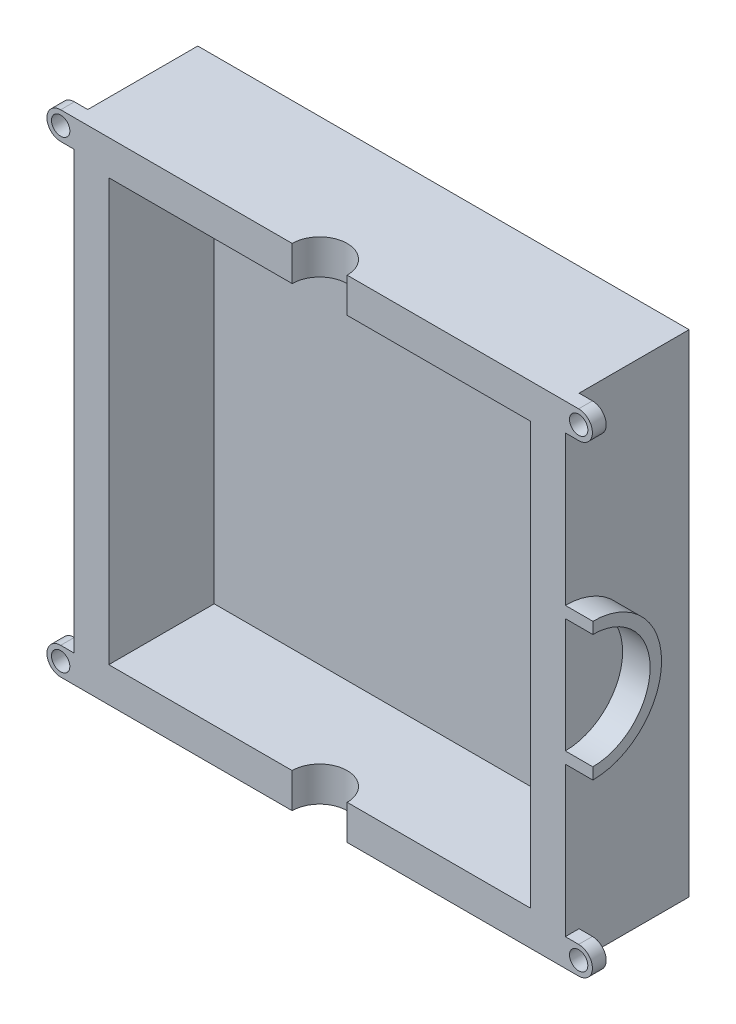
ISO-10303-21;
HEADER;
FILE_DESCRIPTION(('STEP AP214'),'2;1');
FILE_NAME('part.step','',(''),(''),'','','');
FILE_SCHEMA(('AUTOMOTIVE_DESIGN { 1 0 10303 214 1 1 1 1 }'));
ENDSEC;
DATA;
#1=APPLICATION_CONTEXT('core data for automotive mechanical design processes');
#2=APPLICATION_PROTOCOL_DEFINITION('international standard','automotive_design',2000,#1);
#3=PRODUCT_CONTEXT('',#1,'mechanical');
#4=PRODUCT('Part','Part','',(#3));
#5=PRODUCT_RELATED_PRODUCT_CATEGORY('part','',(#4));
#6=PRODUCT_DEFINITION_FORMATION('','',#4);
#7=PRODUCT_DEFINITION_CONTEXT('part definition',#1,'design');
#8=PRODUCT_DEFINITION('design','',#6,#7);
#9=PRODUCT_DEFINITION_SHAPE('','',#8);
#10=(LENGTH_UNIT() NAMED_UNIT(*) SI_UNIT(.MILLI.,.METRE.));
#11=(NAMED_UNIT(*) PLANE_ANGLE_UNIT() SI_UNIT($,.RADIAN.));
#12=(NAMED_UNIT(*) SI_UNIT($,.STERADIAN.) SOLID_ANGLE_UNIT());
#13=UNCERTAINTY_MEASURE_WITH_UNIT(LENGTH_MEASURE(1.E-05),#10,'distance_accuracy_value','');
#14=(GEOMETRIC_REPRESENTATION_CONTEXT(3) GLOBAL_UNCERTAINTY_ASSIGNED_CONTEXT((#13)) GLOBAL_UNIT_ASSIGNED_CONTEXT((#10,
#11,#12)) REPRESENTATION_CONTEXT('',''));
#15=CARTESIAN_POINT('',(0.,0.,0.));
#16=DIRECTION('',(0.,0.,1.));
#17=DIRECTION('',(1.,0.,0.));
#18=AXIS2_PLACEMENT_3D('',#15,#16,#17);
#19=CARTESIAN_POINT('',(53.59,-53.59,27.));
#20=DIRECTION('',(-1.,0.,0.));
#21=DIRECTION('',(0.,0.,1.));
#22=AXIS2_PLACEMENT_3D('',#19,#20,#21);
#23=PLANE('',#22);
#24=DIRECTION('',(0.,1.,0.));
#25=VECTOR('',#24,1.);
#26=CARTESIAN_POINT('',(53.59,-53.59,27.));
#27=LINE('',#26,#25);
#28=CARTESIAN_POINT('',(53.59,-12.5,27.));
#29=VERTEX_POINT('',#28);
#30=CARTESIAN_POINT('',(53.59,12.5,27.));
#31=VERTEX_POINT('',#30);
#32=EDGE_CURVE('E417',#29,#31,#27,.T.);
#33=ORIENTED_EDGE('',*,*,#32,.F.);
#34=CARTESIAN_POINT('',(53.59,0.,27.));
#35=DIRECTION('',(1.,0.,0.));
#36=DIRECTION('',(0.,0.,-1.));
#37=AXIS2_PLACEMENT_3D('',#34,#35,#36);
#38=CIRCLE('',#37,12.5);
#39=EDGE_CURVE('E338',#29,#31,#38,.T.);
#40=ORIENTED_EDGE('',*,*,#39,.T.);
#41=EDGE_LOOP('',(#33,#40));
#42=FACE_BOUND('',#41,.T.);
#43=ADVANCED_FACE('F41',(#42),#23,.F.);
#44=CARTESIAN_POINT('',(-53.59,53.59,27.));
#45=DIRECTION('',(0.,-1.,0.));
#46=DIRECTION('',(0.,0.,-1.));
#47=AXIS2_PLACEMENT_3D('',#44,#45,#46);
#48=PLANE('',#47);
#49=DIRECTION('',(-1.,0.,0.));
#50=VECTOR('',#49,1.);
#51=CARTESIAN_POINT('',(-53.59,53.59,27.));
#52=LINE('',#51,#50);
#53=CARTESIAN_POINT('',(56.5,53.59,27.));
#54=VERTEX_POINT('',#53);
#55=CARTESIAN_POINT('',(6.,53.59,27.));
#56=VERTEX_POINT('',#55);
#57=EDGE_CURVE('E423',#54,#56,#52,.T.);
#58=ORIENTED_EDGE('',*,*,#57,.F.);
#59=DIRECTION('',(0.,0.,1.));
#60=VECTOR('',#59,1.);
#61=CARTESIAN_POINT('',(56.5,53.59,24.));
#62=LINE('',#61,#60);
#63=CARTESIAN_POINT('',(56.5,53.59,24.));
#64=VERTEX_POINT('',#63);
#65=EDGE_CURVE('E242',#64,#54,#62,.T.);
#66=ORIENTED_EDGE('',*,*,#65,.F.);
#67=DIRECTION('',(-1.,0.,0.));
#68=VECTOR('',#67,1.);
#69=CARTESIAN_POINT('',(51.1723022861703,53.59,24.));
#70=LINE('',#69,#68);
#71=CARTESIAN_POINT('',(53.59,53.59,24.));
#72=VERTEX_POINT('',#71);
#73=EDGE_CURVE('E257',#64,#72,#70,.T.);
#74=ORIENTED_EDGE('',*,*,#73,.T.);
#75=DIRECTION('',(0.,0.,-1.));
#76=VECTOR('',#75,1.);
#77=CARTESIAN_POINT('',(53.59,53.59,27.));
#78=LINE('',#77,#76);
#79=CARTESIAN_POINT('',(53.59,53.59,0.));
#80=VERTEX_POINT('',#79);
#81=EDGE_CURVE('E447',#72,#80,#78,.T.);
#82=ORIENTED_EDGE('',*,*,#81,.T.);
#83=DIRECTION('',(-1.,0.,0.));
#84=VECTOR('',#83,1.);
#85=CARTESIAN_POINT('',(-53.59,53.59,0.));
#86=LINE('',#85,#84);
#87=CARTESIAN_POINT('',(-53.59,53.59,0.));
#88=VERTEX_POINT('',#87);
#89=EDGE_CURVE('E435',#80,#88,#86,.T.);
#90=ORIENTED_EDGE('',*,*,#89,.T.);
#91=DIRECTION('',(0.,0.,-1.));
#92=VECTOR('',#91,1.);
#93=CARTESIAN_POINT('',(-53.59,53.59,27.));
#94=LINE('',#93,#92);
#95=CARTESIAN_POINT('',(-53.59,53.59,24.));
#96=VERTEX_POINT('',#95);
#97=EDGE_CURVE('E443',#96,#88,#94,.T.);
#98=ORIENTED_EDGE('',*,*,#97,.F.);
#99=DIRECTION('',(-1.,0.,0.));
#100=VECTOR('',#99,1.);
#101=CARTESIAN_POINT('',(-56.5,53.59,24.));
#102=LINE('',#101,#100);
#103=CARTESIAN_POINT('',(-56.5,53.59,24.));
#104=VERTEX_POINT('',#103);
#105=EDGE_CURVE('E321',#96,#104,#102,.T.);
#106=ORIENTED_EDGE('',*,*,#105,.T.);
#107=DIRECTION('',(0.,0.,1.));
#108=VECTOR('',#107,1.);
#109=CARTESIAN_POINT('',(-56.5,53.59,24.));
#110=LINE('',#109,#108);
#111=CARTESIAN_POINT('',(-56.5,53.59,27.));
#112=VERTEX_POINT('',#111);
#113=EDGE_CURVE('E333',#104,#112,#110,.T.);
#114=ORIENTED_EDGE('',*,*,#113,.T.);
#115=CARTESIAN_POINT('',(-6.,53.59,27.));
#116=VERTEX_POINT('',#115);
#117=EDGE_CURVE('E419',#116,#112,#52,.T.);
#118=ORIENTED_EDGE('',*,*,#117,.F.);
#119=CARTESIAN_POINT('',(0.,53.59,27.));
#120=DIRECTION('',(0.,1.,0.));
#121=DIRECTION('',(0.,0.,1.));
#122=AXIS2_PLACEMENT_3D('',#119,#120,#121);
#123=CIRCLE('',#122,6.);
#124=EDGE_CURVE('E364',#56,#116,#123,.T.);
#125=ORIENTED_EDGE('',*,*,#124,.F.);
#126=EDGE_LOOP('',(#58,#66,#74,#82,#90,#98,#106,#114,#118,#125));
#127=FACE_BOUND('',#126,.T.);
#128=ADVANCED_FACE('F462',(#127),#48,.F.);
#129=CARTESIAN_POINT('',(0.,0.,27.));
#130=DIRECTION('',(0.,0.,-1.));
#131=DIRECTION('',(-1.,0.,0.));
#132=AXIS2_PLACEMENT_3D('',#129,#130,#131);
#133=PLANE('',#132);
#134=ORIENTED_EDGE('',*,*,#117,.T.);
#135=CARTESIAN_POINT('',(-56.5,50.59,27.));
#136=DIRECTION('',(0.,0.,1.));
#137=DIRECTION('',(1.,0.,0.));
#138=AXIS2_PLACEMENT_3D('',#135,#136,#137);
#139=CIRCLE('',#138,3.00000000000001);
#140=CARTESIAN_POINT('',(-56.5,47.59,27.));
#141=VERTEX_POINT('',#140);
#142=EDGE_CURVE('E313',#112,#141,#139,.T.);
#143=ORIENTED_EDGE('',*,*,#142,.T.);
#144=DIRECTION('',(1.,0.,0.));
#145=VECTOR('',#144,1.);
#146=CARTESIAN_POINT('',(-56.5,47.59,27.));
#147=LINE('',#146,#145);
#148=CARTESIAN_POINT('',(-53.59,47.59,27.));
#149=VERTEX_POINT('',#148);
#150=EDGE_CURVE('E322',#141,#149,#147,.T.);
#151=ORIENTED_EDGE('',*,*,#150,.T.);
#152=DIRECTION('',(0.,-1.,0.));
#153=VECTOR('',#152,1.);
#154=CARTESIAN_POINT('',(-53.59,-53.59,27.));
#155=LINE('',#154,#153);
#156=CARTESIAN_POINT('',(-53.59,-47.59,27.));
#157=VERTEX_POINT('',#156);
#158=EDGE_CURVE('E421',#149,#157,#155,.T.);
#159=ORIENTED_EDGE('',*,*,#158,.T.);
#160=DIRECTION('',(-1.,0.,0.));
#161=VECTOR('',#160,1.);
#162=CARTESIAN_POINT('',(-56.5,-47.59,27.));
#163=LINE('',#162,#161);
#164=CARTESIAN_POINT('',(-56.5,-47.59,27.));
#165=VERTEX_POINT('',#164);
#166=EDGE_CURVE('E295',#157,#165,#163,.T.);
#167=ORIENTED_EDGE('',*,*,#166,.T.);
#168=CARTESIAN_POINT('',(-56.5,-50.59,27.));
#169=DIRECTION('',(0.,0.,1.));
#170=DIRECTION('',(-1.,0.,0.));
#171=AXIS2_PLACEMENT_3D('',#168,#169,#170);
#172=CIRCLE('',#171,3.00000000000001);
#173=CARTESIAN_POINT('',(-56.5,-53.59,27.));
#174=VERTEX_POINT('',#173);
#175=EDGE_CURVE('E298',#165,#174,#172,.T.);
#176=ORIENTED_EDGE('',*,*,#175,.T.);
#177=DIRECTION('',(1.,0.,0.));
#178=VECTOR('',#177,1.);
#179=CARTESIAN_POINT('',(-53.59,-53.59,27.));
#180=LINE('',#179,#178);
#181=CARTESIAN_POINT('',(-6.,-53.59,27.));
#182=VERTEX_POINT('',#181);
#183=EDGE_CURVE('E430',#174,#182,#180,.T.);
#184=ORIENTED_EDGE('',*,*,#183,.T.);
#185=DIRECTION('',(0.,1.,0.));
#186=VECTOR('',#185,1.);
#187=CARTESIAN_POINT('',(-6.,-53.59,27.));
#188=LINE('',#187,#186);
#189=CARTESIAN_POINT('',(-6.,-46.,27.));
#190=VERTEX_POINT('',#189);
#191=EDGE_CURVE('E380',#182,#190,#188,.T.);
#192=ORIENTED_EDGE('',*,*,#191,.T.);
#193=DIRECTION('',(1.,0.,0.));
#194=VECTOR('',#193,1.);
#195=CARTESIAN_POINT('',(-46.,-46.,27.));
#196=LINE('',#195,#194);
#197=CARTESIAN_POINT('',(-46.,-46.,27.));
#198=VERTEX_POINT('',#197);
#199=EDGE_CURVE('E381',#198,#190,#196,.T.);
#200=ORIENTED_EDGE('',*,*,#199,.F.);
#201=DIRECTION('',(0.,-1.,0.));
#202=VECTOR('',#201,1.);
#203=CARTESIAN_POINT('',(-46.,46.,27.));
#204=LINE('',#203,#202);
#205=CARTESIAN_POINT('',(-46.,46.,27.));
#206=VERTEX_POINT('',#205);
#207=EDGE_CURVE('E397',#206,#198,#204,.T.);
#208=ORIENTED_EDGE('',*,*,#207,.F.);
#209=DIRECTION('',(-1.,0.,0.));
#210=VECTOR('',#209,1.);
#211=CARTESIAN_POINT('',(-46.,46.,27.));
#212=LINE('',#211,#210);
#213=CARTESIAN_POINT('',(-6.,46.,27.));
#214=VERTEX_POINT('',#213);
#215=EDGE_CURVE('E398',#214,#206,#212,.T.);
#216=ORIENTED_EDGE('',*,*,#215,.F.);
#217=EDGE_CURVE('E375',#214,#116,#188,.T.);
#218=ORIENTED_EDGE('',*,*,#217,.T.);
#219=EDGE_LOOP('',(#134,#143,#151,#159,#167,#176,#184,#192,#200,#208,#216,#218));
#220=FACE_BOUND('',#219,.T.);
#221=CARTESIAN_POINT('',(-56.5,50.59,27.));
#222=DIRECTION('',(0.,0.,1.));
#223=DIRECTION('',(1.,0.,0.));
#224=AXIS2_PLACEMENT_3D('',#221,#222,#223);
#225=CIRCLE('',#224,2.);
#226=CARTESIAN_POINT('',(-54.5,50.59,27.));
#227=VERTEX_POINT('',#226);
#228=EDGE_CURVE('E264',#227,#227,#225,.T.);
#229=ORIENTED_EDGE('',*,*,#228,.F.);
#230=EDGE_LOOP('',(#229));
#231=FACE_BOUND('',#230,.T.);
#232=CARTESIAN_POINT('',(-56.5,-50.59,27.));
#233=DIRECTION('',(0.,0.,1.));
#234=DIRECTION('',(-1.,0.,0.));
#235=AXIS2_PLACEMENT_3D('',#232,#233,#234);
#236=CIRCLE('',#235,2.);
#237=CARTESIAN_POINT('',(-58.5,-50.59,27.));
#238=VERTEX_POINT('',#237);
#239=EDGE_CURVE('E266',#238,#238,#236,.T.);
#240=ORIENTED_EDGE('',*,*,#239,.F.);
#241=EDGE_LOOP('',(#240));
#242=FACE_BOUND('',#241,.T.);
#243=ADVANCED_FACE('F478',(#220,#231,#242),#133,.F.);
#244=CARTESIAN_POINT('',(53.59,-47.59,27.));
#245=VERTEX_POINT('',#244);
#246=CARTESIAN_POINT('',(53.59,-15.,27.));
#247=VERTEX_POINT('',#246);
#248=EDGE_CURVE('E420',#245,#247,#27,.T.);
#249=ORIENTED_EDGE('',*,*,#248,.F.);
#250=DIRECTION('',(0.,0.,-1.));
#251=VECTOR('',#250,1.);
#252=CARTESIAN_POINT('',(53.59,-47.59,27.));
#253=LINE('',#252,#251);
#254=CARTESIAN_POINT('',(53.59,-47.59,24.));
#255=VERTEX_POINT('',#254);
#256=EDGE_CURVE('E340',#245,#255,#253,.T.);
#257=ORIENTED_EDGE('',*,*,#256,.T.);
#258=DIRECTION('',(0.,-1.,0.));
#259=VECTOR('',#258,1.);
#260=CARTESIAN_POINT('',(53.59,-53.59,24.));
#261=LINE('',#260,#259);
#262=CARTESIAN_POINT('',(53.59,-53.59,24.));
#263=VERTEX_POINT('',#262);
#264=EDGE_CURVE('E11',#255,#263,#261,.T.);
#265=ORIENTED_EDGE('',*,*,#264,.T.);
#266=DIRECTION('',(0.,0.,-1.));
#267=VECTOR('',#266,1.);
#268=CARTESIAN_POINT('',(53.59,-53.59,27.));
#269=LINE('',#268,#267);
#270=CARTESIAN_POINT('',(53.59,-53.59,0.));
#271=VERTEX_POINT('',#270);
#272=EDGE_CURVE('E429',#263,#271,#269,.T.);
#273=ORIENTED_EDGE('',*,*,#272,.T.);
#274=DIRECTION('',(0.,1.,0.));
#275=VECTOR('',#274,1.);
#276=CARTESIAN_POINT('',(53.59,-53.59,0.));
#277=LINE('',#276,#275);
#278=EDGE_CURVE('E406',#271,#80,#277,.T.);
#279=ORIENTED_EDGE('',*,*,#278,.T.);
#280=ORIENTED_EDGE('',*,*,#81,.F.);
#281=DIRECTION('',(0.,1.,0.));
#282=VECTOR('',#281,1.);
#283=CARTESIAN_POINT('',(53.59,-53.59,24.));
#284=LINE('',#283,#282);
#285=CARTESIAN_POINT('',(53.59,47.59,24.));
#286=VERTEX_POINT('',#285);
#287=EDGE_CURVE('E47',#286,#72,#284,.T.);
#288=ORIENTED_EDGE('',*,*,#287,.F.);
#289=DIRECTION('',(0.,0.,1.));
#290=VECTOR('',#289,1.);
#291=CARTESIAN_POINT('',(53.59,47.59,27.));
#292=LINE('',#291,#290);
#293=CARTESIAN_POINT('',(53.59,47.59,27.));
#294=VERTEX_POINT('',#293);
#295=EDGE_CURVE('E334',#286,#294,#292,.T.);
#296=ORIENTED_EDGE('',*,*,#295,.T.);
#297=CARTESIAN_POINT('',(53.59,15.,27.));
#298=VERTEX_POINT('',#297);
#299=EDGE_CURVE('E235',#298,#294,#27,.T.);
#300=ORIENTED_EDGE('',*,*,#299,.F.);
#301=CARTESIAN_POINT('',(53.59,0.,27.));
#302=DIRECTION('',(1.,0.,0.));
#303=DIRECTION('',(0.,0.,-1.));
#304=AXIS2_PLACEMENT_3D('',#301,#302,#303);
#305=CIRCLE('',#304,15.);
#306=EDGE_CURVE('E343',#247,#298,#305,.T.);
#307=ORIENTED_EDGE('',*,*,#306,.F.);
#308=EDGE_LOOP('',(#249,#257,#265,#273,#279,#280,#288,#296,#300,#307));
#309=FACE_BOUND('',#308,.T.);
#310=ADVANCED_FACE('F43',(#309),#23,.F.);
#311=CARTESIAN_POINT('',(-53.59,-53.59,27.));
#312=DIRECTION('',(1.,0.,0.));
#313=DIRECTION('',(0.,0.,-1.));
#314=AXIS2_PLACEMENT_3D('',#311,#312,#313);
#315=PLANE('',#314);
#316=DIRECTION('',(0.,1.,0.));
#317=VECTOR('',#316,1.);
#318=CARTESIAN_POINT('',(-53.59,-53.59,24.));
#319=LINE('',#318,#317);
#320=CARTESIAN_POINT('',(-53.59,-53.59,24.));
#321=VERTEX_POINT('',#320);
#322=CARTESIAN_POINT('',(-53.59,-47.59,24.));
#323=VERTEX_POINT('',#322);
#324=EDGE_CURVE('E459',#321,#323,#319,.T.);
#325=ORIENTED_EDGE('',*,*,#324,.T.);
#326=DIRECTION('',(0.,0.,1.));
#327=VECTOR('',#326,1.);
#328=CARTESIAN_POINT('',(-53.59,-47.59,27.));
#329=LINE('',#328,#327);
#330=EDGE_CURVE('E458',#323,#157,#329,.T.);
#331=ORIENTED_EDGE('',*,*,#330,.T.);
#332=ORIENTED_EDGE('',*,*,#158,.F.);
#333=DIRECTION('',(0.,0.,-1.));
#334=VECTOR('',#333,1.);
#335=CARTESIAN_POINT('',(-53.59,47.59,27.));
#336=LINE('',#335,#334);
#337=CARTESIAN_POINT('',(-53.59,47.59,24.));
#338=VERTEX_POINT('',#337);
#339=EDGE_CURVE('E451',#149,#338,#336,.T.);
#340=ORIENTED_EDGE('',*,*,#339,.T.);
#341=DIRECTION('',(0.,-1.,0.));
#342=VECTOR('',#341,1.);
#343=CARTESIAN_POINT('',(-53.59,-53.59,24.));
#344=LINE('',#343,#342);
#345=EDGE_CURVE('E452',#96,#338,#344,.T.);
#346=ORIENTED_EDGE('',*,*,#345,.F.);
#347=ORIENTED_EDGE('',*,*,#97,.T.);
#348=DIRECTION('',(0.,-1.,0.));
#349=VECTOR('',#348,1.);
#350=CARTESIAN_POINT('',(-53.59,-53.59,0.));
#351=LINE('',#350,#349);
#352=CARTESIAN_POINT('',(-53.59,-53.59,0.));
#353=VERTEX_POINT('',#352);
#354=EDGE_CURVE('E434',#88,#353,#351,.T.);
#355=ORIENTED_EDGE('',*,*,#354,.T.);
#356=DIRECTION('',(0.,0.,-1.));
#357=VECTOR('',#356,1.);
#358=CARTESIAN_POINT('',(-53.59,-53.59,27.));
#359=LINE('',#358,#357);
#360=EDGE_CURVE('E445',#321,#353,#359,.T.);
#361=ORIENTED_EDGE('',*,*,#360,.F.);
#362=EDGE_LOOP('',(#325,#331,#332,#340,#346,#347,#355,#361));
#363=FACE_BOUND('',#362,.T.);
#364=ADVANCED_FACE('F513',(#363),#315,.F.);
#365=CARTESIAN_POINT('',(-53.59,-53.59,27.));
#366=DIRECTION('',(0.,1.,0.));
#367=DIRECTION('',(0.,0.,1.));
#368=AXIS2_PLACEMENT_3D('',#365,#366,#367);
#369=PLANE('',#368);
#370=ORIENTED_EDGE('',*,*,#183,.F.);
#371=DIRECTION('',(0.,0.,1.));
#372=VECTOR('',#371,1.);
#373=CARTESIAN_POINT('',(-56.5,-53.59,24.));
#374=LINE('',#373,#372);
#375=CARTESIAN_POINT('',(-56.5,-53.59,24.));
#376=VERTEX_POINT('',#375);
#377=EDGE_CURVE('E290',#376,#174,#374,.T.);
#378=ORIENTED_EDGE('',*,*,#377,.F.);
#379=DIRECTION('',(1.,0.,0.));
#380=VECTOR('',#379,1.);
#381=CARTESIAN_POINT('',(-56.5,-53.59,24.));
#382=LINE('',#381,#380);
#383=EDGE_CURVE('E305',#376,#321,#382,.T.);
#384=ORIENTED_EDGE('',*,*,#383,.T.);
#385=ORIENTED_EDGE('',*,*,#360,.T.);
#386=DIRECTION('',(1.,0.,0.));
#387=VECTOR('',#386,1.);
#388=CARTESIAN_POINT('',(-53.59,-53.59,0.));
#389=LINE('',#388,#387);
#390=EDGE_CURVE('E438',#353,#271,#389,.T.);
#391=ORIENTED_EDGE('',*,*,#390,.T.);
#392=ORIENTED_EDGE('',*,*,#272,.F.);
#393=DIRECTION('',(1.,0.,0.));
#394=VECTOR('',#393,1.);
#395=CARTESIAN_POINT('',(51.1723022861703,-53.59,24.));
#396=LINE('',#395,#394);
#397=CARTESIAN_POINT('',(56.5,-53.59,24.));
#398=VERTEX_POINT('',#397);
#399=EDGE_CURVE('E64',#263,#398,#396,.T.);
#400=ORIENTED_EDGE('',*,*,#399,.T.);
#401=DIRECTION('',(0.,0.,1.));
#402=VECTOR('',#401,1.);
#403=CARTESIAN_POINT('',(56.5,-53.59,24.));
#404=LINE('',#403,#402);
#405=CARTESIAN_POINT('',(56.5,-53.59,27.));
#406=VERTEX_POINT('',#405);
#407=EDGE_CURVE('E262',#398,#406,#404,.T.);
#408=ORIENTED_EDGE('',*,*,#407,.T.);
#409=CARTESIAN_POINT('',(6.,-53.59,27.));
#410=VERTEX_POINT('',#409);
#411=EDGE_CURVE('E428',#410,#406,#180,.T.);
#412=ORIENTED_EDGE('',*,*,#411,.F.);
#413=CARTESIAN_POINT('',(0.,-53.59,27.));
#414=DIRECTION('',(0.,1.,0.));
#415=DIRECTION('',(0.,0.,1.));
#416=AXIS2_PLACEMENT_3D('',#413,#414,#415);
#417=CIRCLE('',#416,6.);
#418=EDGE_CURVE('E362',#410,#182,#417,.T.);
#419=ORIENTED_EDGE('',*,*,#418,.T.);
#420=EDGE_LOOP('',(#370,#378,#384,#385,#391,#392,#400,#408,#412,#419));
#421=FACE_BOUND('',#420,.T.);
#422=ADVANCED_FACE('F502',(#421),#369,.F.);
#423=ORIENTED_EDGE('',*,*,#57,.T.);
#424=DIRECTION('',(0.,1.,0.));
#425=VECTOR('',#424,1.);
#426=CARTESIAN_POINT('',(6.,-53.59,27.));
#427=LINE('',#426,#425);
#428=CARTESIAN_POINT('',(6.,46.,27.));
#429=VERTEX_POINT('',#428);
#430=EDGE_CURVE('E368',#56,#429,#427,.F.);
#431=ORIENTED_EDGE('',*,*,#430,.T.);
#432=CARTESIAN_POINT('',(46.,46.,27.));
#433=VERTEX_POINT('',#432);
#434=EDGE_CURVE('E400',#433,#429,#212,.T.);
#435=ORIENTED_EDGE('',*,*,#434,.F.);
#436=DIRECTION('',(0.,1.,0.));
#437=VECTOR('',#436,1.);
#438=CARTESIAN_POINT('',(46.,46.,27.));
#439=LINE('',#438,#437);
#440=CARTESIAN_POINT('',(46.,-46.,27.));
#441=VERTEX_POINT('',#440);
#442=EDGE_CURVE('E393',#441,#433,#439,.T.);
#443=ORIENTED_EDGE('',*,*,#442,.F.);
#444=CARTESIAN_POINT('',(6.,-46.,27.));
#445=VERTEX_POINT('',#444);
#446=EDGE_CURVE('E401',#445,#441,#196,.T.);
#447=ORIENTED_EDGE('',*,*,#446,.F.);
#448=EDGE_CURVE('E373',#445,#410,#427,.F.);
#449=ORIENTED_EDGE('',*,*,#448,.T.);
#450=ORIENTED_EDGE('',*,*,#411,.T.);
#451=CARTESIAN_POINT('',(56.5,-50.59,27.));
#452=DIRECTION('',(0.,0.,1.));
#453=DIRECTION('',(-1.,0.,0.));
#454=AXIS2_PLACEMENT_3D('',#451,#452,#453);
#455=CIRCLE('',#454,3.00000000000001);
#456=CARTESIAN_POINT('',(56.5,-47.59,27.));
#457=VERTEX_POINT('',#456);
#458=EDGE_CURVE('E275',#406,#457,#455,.T.);
#459=ORIENTED_EDGE('',*,*,#458,.T.);
#460=DIRECTION('',(-1.,0.,0.));
#461=VECTOR('',#460,1.);
#462=CARTESIAN_POINT('',(51.1723022861703,-47.59,27.));
#463=LINE('',#462,#461);
#464=EDGE_CURVE('E269',#457,#245,#463,.T.);
#465=ORIENTED_EDGE('',*,*,#464,.T.);
#466=ORIENTED_EDGE('',*,*,#248,.T.);
#467=DIRECTION('',(-1.,0.,0.));
#468=VECTOR('',#467,1.);
#469=CARTESIAN_POINT('',(59.59,-15.,27.));
#470=LINE('',#469,#468);
#471=CARTESIAN_POINT('',(59.59,-15.,27.));
#472=VERTEX_POINT('',#471);
#473=EDGE_CURVE('E356',#472,#247,#470,.T.);
#474=ORIENTED_EDGE('',*,*,#473,.F.);
#475=DIRECTION('',(0.,-1.,0.));
#476=VECTOR('',#475,1.);
#477=CARTESIAN_POINT('',(59.59,0.,27.));
#478=LINE('',#477,#476);
#479=CARTESIAN_POINT('',(59.59,-12.5,27.));
#480=VERTEX_POINT('',#479);
#481=EDGE_CURVE('E341',#480,#472,#478,.T.);
#482=ORIENTED_EDGE('',*,*,#481,.F.);
#483=DIRECTION('',(-1.,0.,0.));
#484=VECTOR('',#483,1.);
#485=CARTESIAN_POINT('',(59.59,-12.5,27.));
#486=LINE('',#485,#484);
#487=EDGE_CURVE('E363',#480,#29,#486,.T.);
#488=ORIENTED_EDGE('',*,*,#487,.T.);
#489=ORIENTED_EDGE('',*,*,#32,.T.);
#490=DIRECTION('',(-1.,0.,0.));
#491=VECTOR('',#490,1.);
#492=CARTESIAN_POINT('',(59.59,12.5,27.));
#493=LINE('',#492,#491);
#494=CARTESIAN_POINT('',(59.59,12.5,27.));
#495=VERTEX_POINT('',#494);
#496=EDGE_CURVE('E351',#495,#31,#493,.T.);
#497=ORIENTED_EDGE('',*,*,#496,.F.);
#498=CARTESIAN_POINT('',(59.59,15.,27.));
#499=VERTEX_POINT('',#498);
#500=EDGE_CURVE('E350',#499,#495,#478,.T.);
#501=ORIENTED_EDGE('',*,*,#500,.F.);
#502=DIRECTION('',(-1.,0.,0.));
#503=VECTOR('',#502,1.);
#504=CARTESIAN_POINT('',(59.59,15.,27.));
#505=LINE('',#504,#503);
#506=EDGE_CURVE('E358',#499,#298,#505,.T.);
#507=ORIENTED_EDGE('',*,*,#506,.T.);
#508=ORIENTED_EDGE('',*,*,#299,.T.);
#509=DIRECTION('',(1.,0.,0.));
#510=VECTOR('',#509,1.);
#511=CARTESIAN_POINT('',(51.1723022861703,47.59,27.));
#512=LINE('',#511,#510);
#513=CARTESIAN_POINT('',(56.5,47.59,27.));
#514=VERTEX_POINT('',#513);
#515=EDGE_CURVE('E222',#294,#514,#512,.T.);
#516=ORIENTED_EDGE('',*,*,#515,.T.);
#517=CARTESIAN_POINT('',(56.5,50.59,27.));
#518=DIRECTION('',(0.,0.,1.));
#519=DIRECTION('',(1.,0.,0.));
#520=AXIS2_PLACEMENT_3D('',#517,#518,#519);
#521=CIRCLE('',#520,3.00000000000001);
#522=EDGE_CURVE('E229',#514,#54,#521,.T.);
#523=ORIENTED_EDGE('',*,*,#522,.T.);
#524=EDGE_LOOP('',(#423,#431,#435,#443,#447,#449,#450,#459,#465,#466,#474,#482,#488,#489,#497,
#501,#507,#508,#516,#523));
#525=FACE_BOUND('',#524,.T.);
#526=CARTESIAN_POINT('',(56.5,50.59,27.));
#527=DIRECTION('',(0.,0.,1.));
#528=DIRECTION('',(1.,0.,0.));
#529=AXIS2_PLACEMENT_3D('',#526,#527,#528);
#530=CIRCLE('',#529,2.);
#531=CARTESIAN_POINT('',(58.5,50.59,27.));
#532=VERTEX_POINT('',#531);
#533=EDGE_CURVE('E255',#532,#532,#530,.T.);
#534=ORIENTED_EDGE('',*,*,#533,.F.);
#535=EDGE_LOOP('',(#534));
#536=FACE_BOUND('',#535,.T.);
#537=CARTESIAN_POINT('',(56.5,-50.59,27.));
#538=DIRECTION('',(0.,0.,1.));
#539=DIRECTION('',(-1.,0.,0.));
#540=AXIS2_PLACEMENT_3D('',#537,#538,#539);
#541=CIRCLE('',#540,2.);
#542=CARTESIAN_POINT('',(54.5,-50.59,27.));
#543=VERTEX_POINT('',#542);
#544=EDGE_CURVE('E244',#543,#543,#541,.T.);
#545=ORIENTED_EDGE('',*,*,#544,.F.);
#546=EDGE_LOOP('',(#545));
#547=FACE_BOUND('',#546,.T.);
#548=ADVANCED_FACE('F227',(#525,#536,#547),#133,.F.);
#549=CARTESIAN_POINT('',(0.,0.,0.));
#550=DIRECTION('',(0.,0.,-1.));
#551=DIRECTION('',(-1.,0.,0.));
#552=AXIS2_PLACEMENT_3D('',#549,#550,#551);
#553=PLANE('',#552);
#554=ORIENTED_EDGE('',*,*,#278,.F.);
#555=ORIENTED_EDGE('',*,*,#390,.F.);
#556=ORIENTED_EDGE('',*,*,#354,.F.);
#557=ORIENTED_EDGE('',*,*,#89,.F.);
#558=EDGE_LOOP('',(#554,#555,#556,#557));
#559=FACE_BOUND('',#558,.T.);
#560=ADVANCED_FACE('F524',(#559),#553,.T.);
#561=CARTESIAN_POINT('',(46.,46.,4.));
#562=DIRECTION('',(1.,0.,0.));
#563=DIRECTION('',(0.,1.,0.));
#564=AXIS2_PLACEMENT_3D('',#561,#562,#563);
#565=PLANE('',#564);
#566=ORIENTED_EDGE('',*,*,#442,.T.);
#567=DIRECTION('',(0.,0.,1.));
#568=VECTOR('',#567,1.);
#569=CARTESIAN_POINT('',(46.,46.,4.));
#570=LINE('',#569,#568);
#571=CARTESIAN_POINT('',(46.,46.,4.));
#572=VERTEX_POINT('',#571);
#573=EDGE_CURVE('E395',#572,#433,#570,.T.);
#574=ORIENTED_EDGE('',*,*,#573,.F.);
#575=DIRECTION('',(0.,1.,0.));
#576=VECTOR('',#575,1.);
#577=CARTESIAN_POINT('',(46.,46.,4.));
#578=LINE('',#577,#576);
#579=CARTESIAN_POINT('',(46.,-46.,4.));
#580=VERTEX_POINT('',#579);
#581=EDGE_CURVE('E379',#580,#572,#578,.T.);
#582=ORIENTED_EDGE('',*,*,#581,.F.);
#583=DIRECTION('',(0.,0.,1.));
#584=VECTOR('',#583,1.);
#585=CARTESIAN_POINT('',(46.,-46.,4.));
#586=LINE('',#585,#584);
#587=EDGE_CURVE('E407',#580,#441,#586,.T.);
#588=ORIENTED_EDGE('',*,*,#587,.T.);
#589=EDGE_LOOP('',(#566,#574,#582,#588));
#590=FACE_BOUND('',#589,.T.);
#591=ADVANCED_FACE('F495',(#590),#565,.F.);
#592=CARTESIAN_POINT('',(-46.,-46.,4.));
#593=DIRECTION('',(0.,-1.,0.));
#594=DIRECTION('',(0.,0.,-1.));
#595=AXIS2_PLACEMENT_3D('',#592,#593,#594);
#596=PLANE('',#595);
#597=ORIENTED_EDGE('',*,*,#199,.T.);
#598=CARTESIAN_POINT('',(0.,-46.,27.));
#599=DIRECTION('',(0.,-1.,0.));
#600=DIRECTION('',(0.,0.,-1.));
#601=AXIS2_PLACEMENT_3D('',#598,#599,#600);
#602=CIRCLE('',#601,6.);
#603=EDGE_CURVE('E376',#190,#445,#602,.T.);
#604=ORIENTED_EDGE('',*,*,#603,.T.);
#605=ORIENTED_EDGE('',*,*,#446,.T.);
#606=ORIENTED_EDGE('',*,*,#587,.F.);
#607=DIRECTION('',(1.,0.,0.));
#608=VECTOR('',#607,1.);
#609=CARTESIAN_POINT('',(-46.,-46.,4.));
#610=LINE('',#609,#608);
#611=CARTESIAN_POINT('',(-46.,-46.,4.));
#612=VERTEX_POINT('',#611);
#613=EDGE_CURVE('E388',#612,#580,#610,.T.);
#614=ORIENTED_EDGE('',*,*,#613,.F.);
#615=DIRECTION('',(0.,0.,1.));
#616=VECTOR('',#615,1.);
#617=CARTESIAN_POINT('',(-46.,-46.,4.));
#618=LINE('',#617,#616);
#619=EDGE_CURVE('E408',#612,#198,#618,.T.);
#620=ORIENTED_EDGE('',*,*,#619,.T.);
#621=EDGE_LOOP('',(#597,#604,#605,#606,#614,#620));
#622=FACE_BOUND('',#621,.T.);
#623=ADVANCED_FACE('F498',(#622),#596,.F.);
#624=CARTESIAN_POINT('',(-46.,46.,4.));
#625=DIRECTION('',(-1.,0.,0.));
#626=DIRECTION('',(0.,-1.,0.));
#627=AXIS2_PLACEMENT_3D('',#624,#625,#626);
#628=PLANE('',#627);
#629=ORIENTED_EDGE('',*,*,#207,.T.);
#630=ORIENTED_EDGE('',*,*,#619,.F.);
#631=DIRECTION('',(0.,-1.,0.));
#632=VECTOR('',#631,1.);
#633=CARTESIAN_POINT('',(-46.,46.,4.));
#634=LINE('',#633,#632);
#635=CARTESIAN_POINT('',(-46.,46.,4.));
#636=VERTEX_POINT('',#635);
#637=EDGE_CURVE('E390',#636,#612,#634,.T.);
#638=ORIENTED_EDGE('',*,*,#637,.F.);
#639=DIRECTION('',(0.,0.,1.));
#640=VECTOR('',#639,1.);
#641=CARTESIAN_POINT('',(-46.,46.,4.));
#642=LINE('',#641,#640);
#643=EDGE_CURVE('E411',#636,#206,#642,.T.);
#644=ORIENTED_EDGE('',*,*,#643,.T.);
#645=EDGE_LOOP('',(#629,#630,#638,#644));
#646=FACE_BOUND('',#645,.T.);
#647=ADVANCED_FACE('F484',(#646),#628,.F.);
#648=CARTESIAN_POINT('',(-46.,46.,4.));
#649=DIRECTION('',(0.,1.,0.));
#650=DIRECTION('',(0.,0.,1.));
#651=AXIS2_PLACEMENT_3D('',#648,#649,#650);
#652=PLANE('',#651);
#653=ORIENTED_EDGE('',*,*,#434,.T.);
#654=CARTESIAN_POINT('',(0.,46.,27.));
#655=DIRECTION('',(0.,1.,0.));
#656=DIRECTION('',(0.,0.,1.));
#657=AXIS2_PLACEMENT_3D('',#654,#655,#656);
#658=CIRCLE('',#657,6.);
#659=EDGE_CURVE('E449',#429,#214,#658,.T.);
#660=ORIENTED_EDGE('',*,*,#659,.T.);
#661=ORIENTED_EDGE('',*,*,#215,.T.);
#662=ORIENTED_EDGE('',*,*,#643,.F.);
#663=DIRECTION('',(-1.,0.,0.));
#664=VECTOR('',#663,1.);
#665=CARTESIAN_POINT('',(-46.,46.,4.));
#666=LINE('',#665,#664);
#667=EDGE_CURVE('E384',#572,#636,#666,.T.);
#668=ORIENTED_EDGE('',*,*,#667,.F.);
#669=ORIENTED_EDGE('',*,*,#573,.T.);
#670=EDGE_LOOP('',(#653,#660,#661,#662,#668,#669));
#671=FACE_BOUND('',#670,.T.);
#672=ADVANCED_FACE('F479',(#671),#652,.F.);
#673=CARTESIAN_POINT('',(0.,0.,4.));
#674=DIRECTION('',(0.,0.,1.));
#675=DIRECTION('',(1.,0.,0.));
#676=AXIS2_PLACEMENT_3D('',#673,#674,#675);
#677=PLANE('',#676);
#678=ORIENTED_EDGE('',*,*,#581,.T.);
#679=ORIENTED_EDGE('',*,*,#667,.T.);
#680=ORIENTED_EDGE('',*,*,#637,.T.);
#681=ORIENTED_EDGE('',*,*,#613,.T.);
#682=EDGE_LOOP('',(#678,#679,#680,#681));
#683=FACE_BOUND('',#682,.T.);
#684=ADVANCED_FACE('F490',(#683),#677,.T.);
#685=CARTESIAN_POINT('',(0.,-53.59,27.));
#686=DIRECTION('',(0.,1.,0.));
#687=DIRECTION('',(0.,0.,1.));
#688=AXIS2_PLACEMENT_3D('',#685,#686,#687);
#689=CYLINDRICAL_SURFACE('',#688,6.);
#690=ORIENTED_EDGE('',*,*,#659,.F.);
#691=ORIENTED_EDGE('',*,*,#430,.F.);
#692=ORIENTED_EDGE('',*,*,#124,.T.);
#693=ORIENTED_EDGE('',*,*,#217,.F.);
#694=EDGE_LOOP('',(#690,#691,#692,#693));
#695=FACE_BOUND('',#694,.T.);
#696=ADVANCED_FACE('F474',(#695),#689,.F.);
#697=ORIENTED_EDGE('',*,*,#418,.F.);
#698=ORIENTED_EDGE('',*,*,#448,.F.);
#699=ORIENTED_EDGE('',*,*,#603,.F.);
#700=ORIENTED_EDGE('',*,*,#191,.F.);
#701=EDGE_LOOP('',(#697,#698,#699,#700));
#702=FACE_BOUND('',#701,.T.);
#703=ADVANCED_FACE('F501',(#702),#689,.F.);
#704=CARTESIAN_POINT('',(59.59,0.,27.));
#705=DIRECTION('',(-1.,0.,0.));
#706=DIRECTION('',(0.,0.,1.));
#707=AXIS2_PLACEMENT_3D('',#704,#705,#706);
#708=CYLINDRICAL_SURFACE('',#707,12.5);
#709=ORIENTED_EDGE('',*,*,#39,.F.);
#710=ORIENTED_EDGE('',*,*,#487,.F.);
#711=CARTESIAN_POINT('',(59.59,0.,27.));
#712=DIRECTION('',(1.,0.,0.));
#713=DIRECTION('',(0.,0.,-1.));
#714=AXIS2_PLACEMENT_3D('',#711,#712,#713);
#715=CIRCLE('',#714,12.5);
#716=EDGE_CURVE('E342',#480,#495,#715,.T.);
#717=ORIENTED_EDGE('',*,*,#716,.T.);
#718=ORIENTED_EDGE('',*,*,#496,.T.);
#719=EDGE_LOOP('',(#709,#710,#717,#718));
#720=FACE_BOUND('',#719,.T.);
#721=ADVANCED_FACE('F546',(#720),#708,.F.);
#722=CARTESIAN_POINT('',(59.59,0.,27.));
#723=DIRECTION('',(-1.,0.,0.));
#724=DIRECTION('',(0.,0.,1.));
#725=AXIS2_PLACEMENT_3D('',#722,#723,#724);
#726=CYLINDRICAL_SURFACE('',#725,15.);
#727=ORIENTED_EDGE('',*,*,#306,.T.);
#728=ORIENTED_EDGE('',*,*,#506,.F.);
#729=CARTESIAN_POINT('',(59.59,0.,27.));
#730=DIRECTION('',(1.,0.,0.));
#731=DIRECTION('',(0.,0.,-1.));
#732=AXIS2_PLACEMENT_3D('',#729,#730,#731);
#733=CIRCLE('',#732,15.);
#734=EDGE_CURVE('E346',#472,#499,#733,.T.);
#735=ORIENTED_EDGE('',*,*,#734,.F.);
#736=ORIENTED_EDGE('',*,*,#473,.T.);
#737=EDGE_LOOP('',(#727,#728,#735,#736));
#738=FACE_BOUND('',#737,.T.);
#739=ADVANCED_FACE('F539',(#738),#726,.T.);
#740=CARTESIAN_POINT('',(59.59,0.,0.));
#741=DIRECTION('',(1.,0.,0.));
#742=DIRECTION('',(0.,0.,-1.));
#743=AXIS2_PLACEMENT_3D('',#740,#741,#742);
#744=PLANE('',#743);
#745=ORIENTED_EDGE('',*,*,#716,.F.);
#746=ORIENTED_EDGE('',*,*,#481,.T.);
#747=ORIENTED_EDGE('',*,*,#734,.T.);
#748=ORIENTED_EDGE('',*,*,#500,.T.);
#749=EDGE_LOOP('',(#745,#746,#747,#748));
#750=FACE_BOUND('',#749,.T.);
#751=ADVANCED_FACE('F543',(#750),#744,.T.);
#752=CARTESIAN_POINT('',(-56.5,47.59,24.));
#753=DIRECTION('',(0.,-1.,0.));
#754=DIRECTION('',(0.,0.,-1.));
#755=AXIS2_PLACEMENT_3D('',#752,#753,#754);
#756=PLANE('',#755);
#757=ORIENTED_EDGE('',*,*,#339,.F.);
#758=ORIENTED_EDGE('',*,*,#150,.F.);
#759=DIRECTION('',(0.,0.,1.));
#760=VECTOR('',#759,1.);
#761=CARTESIAN_POINT('',(-56.5,47.59,24.));
#762=LINE('',#761,#760);
#763=CARTESIAN_POINT('',(-56.5,47.59,24.));
#764=VERTEX_POINT('',#763);
#765=EDGE_CURVE('E329',#764,#141,#762,.T.);
#766=ORIENTED_EDGE('',*,*,#765,.F.);
#767=DIRECTION('',(1.,0.,0.));
#768=VECTOR('',#767,1.);
#769=CARTESIAN_POINT('',(-56.5,47.59,24.));
#770=LINE('',#769,#768);
#771=EDGE_CURVE('E318',#764,#338,#770,.T.);
#772=ORIENTED_EDGE('',*,*,#771,.T.);
#773=EDGE_LOOP('',(#757,#758,#766,#772));
#774=FACE_BOUND('',#773,.T.);
#775=ADVANCED_FACE('F697',(#774),#756,.T.);
#776=CARTESIAN_POINT('',(-56.5,50.59,24.));
#777=DIRECTION('',(0.,0.,1.));
#778=DIRECTION('',(1.,0.,0.));
#779=AXIS2_PLACEMENT_3D('',#776,#777,#778);
#780=PLANE('',#779);
#781=CARTESIAN_POINT('',(-56.5,50.59,24.));
#782=DIRECTION('',(0.,0.,1.));
#783=DIRECTION('',(1.,0.,0.));
#784=AXIS2_PLACEMENT_3D('',#781,#782,#783);
#785=CIRCLE('',#784,2.);
#786=CARTESIAN_POINT('',(-54.5,50.59,24.));
#787=VERTEX_POINT('',#786);
#788=EDGE_CURVE('E311',#787,#787,#785,.T.);
#789=ORIENTED_EDGE('',*,*,#788,.T.);
#790=EDGE_LOOP('',(#789));
#791=FACE_BOUND('',#790,.T.);
#792=ORIENTED_EDGE('',*,*,#105,.F.);
#793=ORIENTED_EDGE('',*,*,#345,.T.);
#794=ORIENTED_EDGE('',*,*,#771,.F.);
#795=CARTESIAN_POINT('',(-56.5,50.59,24.));
#796=DIRECTION('',(0.,0.,1.));
#797=DIRECTION('',(1.,0.,0.));
#798=AXIS2_PLACEMENT_3D('',#795,#796,#797);
#799=CIRCLE('',#798,3.00000000000001);
#800=EDGE_CURVE('E320',#104,#764,#799,.T.);
#801=ORIENTED_EDGE('',*,*,#800,.F.);
#802=EDGE_LOOP('',(#792,#793,#794,#801));
#803=FACE_BOUND('',#802,.T.);
#804=ADVANCED_FACE('F710',(#791,#803),#780,.F.);
#805=CARTESIAN_POINT('',(-56.5,50.59,24.));
#806=DIRECTION('',(0.,0.,1.));
#807=DIRECTION('',(1.,0.,0.));
#808=AXIS2_PLACEMENT_3D('',#805,#806,#807);
#809=CYLINDRICAL_SURFACE('',#808,3.00000000000001);
#810=ORIENTED_EDGE('',*,*,#142,.F.);
#811=ORIENTED_EDGE('',*,*,#113,.F.);
#812=ORIENTED_EDGE('',*,*,#800,.T.);
#813=ORIENTED_EDGE('',*,*,#765,.T.);
#814=EDGE_LOOP('',(#810,#811,#812,#813));
#815=FACE_BOUND('',#814,.T.);
#816=ADVANCED_FACE('F719',(#815),#809,.T.);
#817=CARTESIAN_POINT('',(-56.5,50.59,24.));
#818=DIRECTION('',(0.,0.,1.));
#819=DIRECTION('',(1.,0.,0.));
#820=AXIS2_PLACEMENT_3D('',#817,#818,#819);
#821=CYLINDRICAL_SURFACE('',#820,2.);
#822=ORIENTED_EDGE('',*,*,#788,.F.);
#823=EDGE_LOOP('',(#822));
#824=FACE_BOUND('',#823,.T.);
#825=ORIENTED_EDGE('',*,*,#228,.T.);
#826=EDGE_LOOP('',(#825));
#827=FACE_BOUND('',#826,.T.);
#828=ADVANCED_FACE('F722',(#824,#827),#821,.F.);
#829=CARTESIAN_POINT('',(-56.5,-47.59,24.));
#830=DIRECTION('',(0.,1.,0.));
#831=DIRECTION('',(0.,0.,1.));
#832=AXIS2_PLACEMENT_3D('',#829,#830,#831);
#833=PLANE('',#832);
#834=ORIENTED_EDGE('',*,*,#330,.F.);
#835=DIRECTION('',(-1.,0.,0.));
#836=VECTOR('',#835,1.);
#837=CARTESIAN_POINT('',(-56.5,-47.59,24.));
#838=LINE('',#837,#836);
#839=CARTESIAN_POINT('',(-56.5,-47.59,24.));
#840=VERTEX_POINT('',#839);
#841=EDGE_CURVE('E287',#323,#840,#838,.T.);
#842=ORIENTED_EDGE('',*,*,#841,.T.);
#843=DIRECTION('',(0.,0.,1.));
#844=VECTOR('',#843,1.);
#845=CARTESIAN_POINT('',(-56.5,-47.59,24.));
#846=LINE('',#845,#844);
#847=EDGE_CURVE('E293',#840,#165,#846,.T.);
#848=ORIENTED_EDGE('',*,*,#847,.T.);
#849=ORIENTED_EDGE('',*,*,#166,.F.);
#850=EDGE_LOOP('',(#834,#842,#848,#849));
#851=FACE_BOUND('',#850,.T.);
#852=ADVANCED_FACE('F731',(#851),#833,.T.);
#853=CARTESIAN_POINT('',(-56.5,-50.59,24.));
#854=DIRECTION('',(0.,0.,-1.));
#855=DIRECTION('',(-1.,0.,0.));
#856=AXIS2_PLACEMENT_3D('',#853,#854,#855);
#857=PLANE('',#856);
#858=CARTESIAN_POINT('',(-56.5,-50.59,24.));
#859=DIRECTION('',(0.,0.,1.));
#860=DIRECTION('',(-1.,0.,0.));
#861=AXIS2_PLACEMENT_3D('',#858,#859,#860);
#862=CIRCLE('',#861,2.);
#863=CARTESIAN_POINT('',(-58.5,-50.59,24.));
#864=VERTEX_POINT('',#863);
#865=EDGE_CURVE('E297',#864,#864,#862,.T.);
#866=ORIENTED_EDGE('',*,*,#865,.T.);
#867=EDGE_LOOP('',(#866));
#868=FACE_BOUND('',#867,.T.);
#869=ORIENTED_EDGE('',*,*,#324,.F.);
#870=ORIENTED_EDGE('',*,*,#383,.F.);
#871=CARTESIAN_POINT('',(-56.5,-50.59,24.));
#872=DIRECTION('',(0.,0.,1.));
#873=DIRECTION('',(-1.,0.,0.));
#874=AXIS2_PLACEMENT_3D('',#871,#872,#873);
#875=CIRCLE('',#874,3.00000000000001);
#876=EDGE_CURVE('E300',#840,#376,#875,.T.);
#877=ORIENTED_EDGE('',*,*,#876,.F.);
#878=ORIENTED_EDGE('',*,*,#841,.F.);
#879=EDGE_LOOP('',(#869,#870,#877,#878));
#880=FACE_BOUND('',#879,.T.);
#881=ADVANCED_FACE('F512',(#868,#880),#857,.T.);
#882=CARTESIAN_POINT('',(-56.5,-50.59,24.));
#883=DIRECTION('',(0.,0.,1.));
#884=DIRECTION('',(1.,0.,0.));
#885=AXIS2_PLACEMENT_3D('',#882,#883,#884);
#886=CYLINDRICAL_SURFACE('',#885,3.00000000000001);
#887=ORIENTED_EDGE('',*,*,#175,.F.);
#888=ORIENTED_EDGE('',*,*,#847,.F.);
#889=ORIENTED_EDGE('',*,*,#876,.T.);
#890=ORIENTED_EDGE('',*,*,#377,.T.);
#891=EDGE_LOOP('',(#887,#888,#889,#890));
#892=FACE_BOUND('',#891,.T.);
#893=ADVANCED_FACE('F510',(#892),#886,.T.);
#894=CARTESIAN_POINT('',(-56.5,-50.59,24.));
#895=DIRECTION('',(0.,0.,1.));
#896=DIRECTION('',(1.,0.,0.));
#897=AXIS2_PLACEMENT_3D('',#894,#895,#896);
#898=CYLINDRICAL_SURFACE('',#897,2.);
#899=ORIENTED_EDGE('',*,*,#865,.F.);
#900=EDGE_LOOP('',(#899));
#901=FACE_BOUND('',#900,.T.);
#902=ORIENTED_EDGE('',*,*,#239,.T.);
#903=EDGE_LOOP('',(#902));
#904=FACE_BOUND('',#903,.T.);
#905=ADVANCED_FACE('F757',(#901,#904),#898,.F.);
#906=CARTESIAN_POINT('',(56.5,50.59,24.));
#907=DIRECTION('',(0.,0.,1.));
#908=DIRECTION('',(1.,0.,0.));
#909=AXIS2_PLACEMENT_3D('',#906,#907,#908);
#910=PLANE('',#909);
#911=CARTESIAN_POINT('',(56.5,50.59,24.));
#912=DIRECTION('',(0.,0.,1.));
#913=DIRECTION('',(1.,0.,0.));
#914=AXIS2_PLACEMENT_3D('',#911,#912,#913);
#915=CIRCLE('',#914,2.);
#916=CARTESIAN_POINT('',(58.5,50.59,24.));
#917=VERTEX_POINT('',#916);
#918=EDGE_CURVE('E248',#917,#917,#915,.T.);
#919=ORIENTED_EDGE('',*,*,#918,.T.);
#920=EDGE_LOOP('',(#919));
#921=FACE_BOUND('',#920,.T.);
#922=DIRECTION('',(1.,0.,0.));
#923=VECTOR('',#922,1.);
#924=CARTESIAN_POINT('',(51.1723022861703,47.59,24.));
#925=LINE('',#924,#923);
#926=CARTESIAN_POINT('',(56.5,47.59,24.));
#927=VERTEX_POINT('',#926);
#928=EDGE_CURVE('E239',#286,#927,#925,.T.);
#929=ORIENTED_EDGE('',*,*,#928,.F.);
#930=ORIENTED_EDGE('',*,*,#287,.T.);
#931=ORIENTED_EDGE('',*,*,#73,.F.);
#932=CARTESIAN_POINT('',(56.5,50.59,24.));
#933=DIRECTION('',(0.,0.,1.));
#934=DIRECTION('',(1.,0.,0.));
#935=AXIS2_PLACEMENT_3D('',#932,#933,#934);
#936=CIRCLE('',#935,3.00000000000001);
#937=EDGE_CURVE('E234',#927,#64,#936,.T.);
#938=ORIENTED_EDGE('',*,*,#937,.F.);
#939=EDGE_LOOP('',(#929,#930,#931,#938));
#940=FACE_BOUND('',#939,.T.);
#941=ADVANCED_FACE('F461',(#921,#940),#910,.F.);
#942=CARTESIAN_POINT('',(51.1723022861703,47.59,24.));
#943=DIRECTION('',(0.,-1.,0.));
#944=DIRECTION('',(0.,0.,-1.));
#945=AXIS2_PLACEMENT_3D('',#942,#943,#944);
#946=PLANE('',#945);
#947=ORIENTED_EDGE('',*,*,#295,.F.);
#948=ORIENTED_EDGE('',*,*,#928,.T.);
#949=DIRECTION('',(0.,0.,1.));
#950=VECTOR('',#949,1.);
#951=CARTESIAN_POINT('',(56.5,47.59,24.));
#952=LINE('',#951,#950);
#953=EDGE_CURVE('E240',#927,#514,#952,.T.);
#954=ORIENTED_EDGE('',*,*,#953,.T.);
#955=ORIENTED_EDGE('',*,*,#515,.F.);
#956=EDGE_LOOP('',(#947,#948,#954,#955));
#957=FACE_BOUND('',#956,.T.);
#958=ADVANCED_FACE('F238',(#957),#946,.T.);
#959=CARTESIAN_POINT('',(56.5,50.59,24.));
#960=DIRECTION('',(0.,0.,1.));
#961=DIRECTION('',(1.,0.,0.));
#962=AXIS2_PLACEMENT_3D('',#959,#960,#961);
#963=CYLINDRICAL_SURFACE('',#962,3.00000000000001);
#964=ORIENTED_EDGE('',*,*,#522,.F.);
#965=ORIENTED_EDGE('',*,*,#953,.F.);
#966=ORIENTED_EDGE('',*,*,#937,.T.);
#967=ORIENTED_EDGE('',*,*,#65,.T.);
#968=EDGE_LOOP('',(#964,#965,#966,#967));
#969=FACE_BOUND('',#968,.T.);
#970=ADVANCED_FACE('F247',(#969),#963,.T.);
#971=CARTESIAN_POINT('',(56.5,50.59,24.));
#972=DIRECTION('',(0.,0.,1.));
#973=DIRECTION('',(1.,0.,0.));
#974=AXIS2_PLACEMENT_3D('',#971,#972,#973);
#975=CYLINDRICAL_SURFACE('',#974,2.);
#976=ORIENTED_EDGE('',*,*,#918,.F.);
#977=EDGE_LOOP('',(#976));
#978=FACE_BOUND('',#977,.T.);
#979=ORIENTED_EDGE('',*,*,#533,.T.);
#980=EDGE_LOOP('',(#979));
#981=FACE_BOUND('',#980,.T.);
#982=ADVANCED_FACE('F787',(#978,#981),#975,.F.);
#983=CARTESIAN_POINT('',(56.5,-50.59,24.));
#984=DIRECTION('',(0.,0.,-1.));
#985=DIRECTION('',(-1.,0.,0.));
#986=AXIS2_PLACEMENT_3D('',#983,#984,#985);
#987=PLANE('',#986);
#988=CARTESIAN_POINT('',(56.5,-50.59,24.));
#989=DIRECTION('',(0.,0.,1.));
#990=DIRECTION('',(-1.,0.,0.));
#991=AXIS2_PLACEMENT_3D('',#988,#989,#990);
#992=CIRCLE('',#991,2.);
#993=CARTESIAN_POINT('',(54.5,-50.59,24.));
#994=VERTEX_POINT('',#993);
#995=EDGE_CURVE('E277',#994,#994,#992,.T.);
#996=ORIENTED_EDGE('',*,*,#995,.T.);
#997=EDGE_LOOP('',(#996));
#998=FACE_BOUND('',#997,.T.);
#999=ORIENTED_EDGE('',*,*,#264,.F.);
#1000=DIRECTION('',(-1.,0.,0.));
#1001=VECTOR('',#1000,1.);
#1002=CARTESIAN_POINT('',(51.1723022861703,-47.59,24.));
#1003=LINE('',#1002,#1001);
#1004=CARTESIAN_POINT('',(56.5,-47.59,24.));
#1005=VERTEX_POINT('',#1004);
#1006=EDGE_CURVE('E279',#1005,#255,#1003,.T.);
#1007=ORIENTED_EDGE('',*,*,#1006,.F.);
#1008=CARTESIAN_POINT('',(56.5,-50.59,24.));
#1009=DIRECTION('',(0.,0.,1.));
#1010=DIRECTION('',(-1.,0.,0.));
#1011=AXIS2_PLACEMENT_3D('',#1008,#1009,#1010);
#1012=CIRCLE('',#1011,3.00000000000001);
#1013=EDGE_CURVE('E271',#398,#1005,#1012,.T.);
#1014=ORIENTED_EDGE('',*,*,#1013,.F.);
#1015=ORIENTED_EDGE('',*,*,#399,.F.);
#1016=EDGE_LOOP('',(#999,#1007,#1014,#1015));
#1017=FACE_BOUND('',#1016,.T.);
#1018=ADVANCED_FACE('F528',(#998,#1017),#987,.T.);
#1019=CARTESIAN_POINT('',(51.1723022861703,-47.59,24.));
#1020=DIRECTION('',(0.,1.,0.));
#1021=DIRECTION('',(0.,0.,1.));
#1022=AXIS2_PLACEMENT_3D('',#1019,#1020,#1021);
#1023=PLANE('',#1022);
#1024=ORIENTED_EDGE('',*,*,#256,.F.);
#1025=ORIENTED_EDGE('',*,*,#464,.F.);
#1026=DIRECTION('',(0.,0.,1.));
#1027=VECTOR('',#1026,1.);
#1028=CARTESIAN_POINT('',(56.5,-47.59,24.));
#1029=LINE('',#1028,#1027);
#1030=EDGE_CURVE('E265',#1005,#457,#1029,.T.);
#1031=ORIENTED_EDGE('',*,*,#1030,.F.);
#1032=ORIENTED_EDGE('',*,*,#1006,.T.);
#1033=EDGE_LOOP('',(#1024,#1025,#1031,#1032));
#1034=FACE_BOUND('',#1033,.T.);
#1035=ADVANCED_FACE('F526',(#1034),#1023,.T.);
#1036=CARTESIAN_POINT('',(56.5,-50.59,24.));
#1037=DIRECTION('',(0.,0.,1.));
#1038=DIRECTION('',(1.,0.,0.));
#1039=AXIS2_PLACEMENT_3D('',#1036,#1037,#1038);
#1040=CYLINDRICAL_SURFACE('',#1039,3.00000000000001);
#1041=ORIENTED_EDGE('',*,*,#458,.F.);
#1042=ORIENTED_EDGE('',*,*,#407,.F.);
#1043=ORIENTED_EDGE('',*,*,#1013,.T.);
#1044=ORIENTED_EDGE('',*,*,#1030,.T.);
#1045=EDGE_LOOP('',(#1041,#1042,#1043,#1044));
#1046=FACE_BOUND('',#1045,.T.);
#1047=ADVANCED_FACE('F535',(#1046),#1040,.T.);
#1048=CARTESIAN_POINT('',(56.5,-50.59,24.));
#1049=DIRECTION('',(0.,0.,1.));
#1050=DIRECTION('',(1.,0.,0.));
#1051=AXIS2_PLACEMENT_3D('',#1048,#1049,#1050);
#1052=CYLINDRICAL_SURFACE('',#1051,2.);
#1053=ORIENTED_EDGE('',*,*,#995,.F.);
#1054=EDGE_LOOP('',(#1053));
#1055=FACE_BOUND('',#1054,.T.);
#1056=ORIENTED_EDGE('',*,*,#544,.T.);
#1057=EDGE_LOOP('',(#1056));
#1058=FACE_BOUND('',#1057,.T.);
#1059=ADVANCED_FACE('F821',(#1055,#1058),#1052,.F.);
#1060=CLOSED_SHELL('',(#43,#128,#243,#310,#364,#422,#548,#560,#591,#623,#647,#672,#684,#696,
#703,#721,#739,#751,#775,#804,#816,#828,#852,#881,#893,#905,#941,#958,#970,#982,#1018,#1035,
#1047,#1059));
#1061=MANIFOLD_SOLID_BREP('B2',#1060);
#1062=ADVANCED_BREP_SHAPE_REPRESENTATION('',(#18,#1061),#14);
#1063=SHAPE_DEFINITION_REPRESENTATION(#9,#1062);
ENDSEC;
END-ISO-10303-21;
